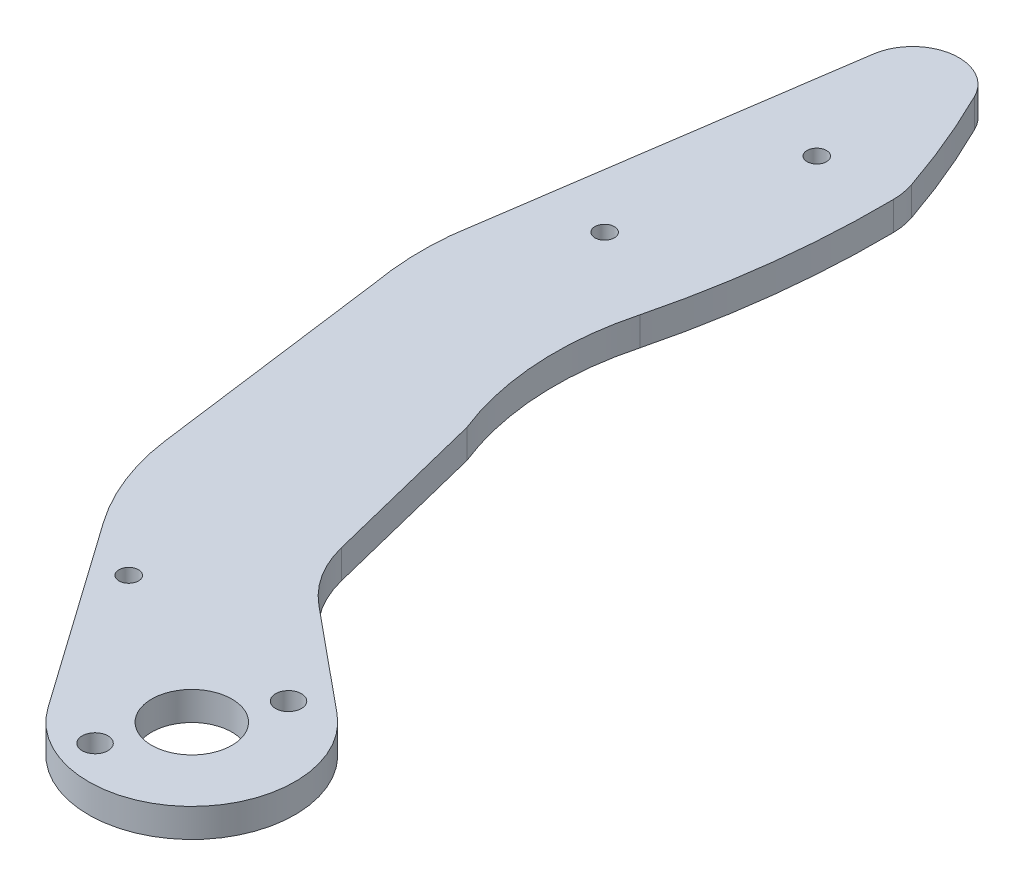
ISO-10303-21;
HEADER;
FILE_DESCRIPTION(('STEP AP214'),'2;1');
FILE_NAME('part.step','',(''),(''),'','','');
FILE_SCHEMA(('AUTOMOTIVE_DESIGN { 1 0 10303 214 1 1 1 1 }'));
ENDSEC;
DATA;
#1=APPLICATION_CONTEXT('core data for automotive mechanical design processes');
#2=APPLICATION_PROTOCOL_DEFINITION('international standard','automotive_design',2000,#1);
#3=PRODUCT_CONTEXT('',#1,'mechanical');
#4=PRODUCT('Part','Part','',(#3));
#5=PRODUCT_RELATED_PRODUCT_CATEGORY('part','',(#4));
#6=PRODUCT_DEFINITION_FORMATION('','',#4);
#7=PRODUCT_DEFINITION_CONTEXT('part definition',#1,'design');
#8=PRODUCT_DEFINITION('design','',#6,#7);
#9=PRODUCT_DEFINITION_SHAPE('','',#8);
#10=(LENGTH_UNIT() NAMED_UNIT(*) SI_UNIT(.MILLI.,.METRE.));
#11=(NAMED_UNIT(*) PLANE_ANGLE_UNIT() SI_UNIT($,.RADIAN.));
#12=(NAMED_UNIT(*) SI_UNIT($,.STERADIAN.) SOLID_ANGLE_UNIT());
#13=UNCERTAINTY_MEASURE_WITH_UNIT(LENGTH_MEASURE(1.E-05),#10,'distance_accuracy_value','');
#14=(GEOMETRIC_REPRESENTATION_CONTEXT(3) GLOBAL_UNCERTAINTY_ASSIGNED_CONTEXT((#13)) GLOBAL_UNIT_ASSIGNED_CONTEXT((#10,
#11,#12)) REPRESENTATION_CONTEXT('',''));
#15=CARTESIAN_POINT('',(0.,0.,0.));
#16=DIRECTION('',(0.,0.,1.));
#17=DIRECTION('',(1.,0.,0.));
#18=AXIS2_PLACEMENT_3D('',#15,#16,#17);
#19=CARTESIAN_POINT('',(0.,5.,0.));
#20=DIRECTION('',(0.,-1.,0.));
#21=DIRECTION('',(0.,0.,-1.));
#22=AXIS2_PLACEMENT_3D('',#19,#20,#21);
#23=PLANE('',#22);
#24=CARTESIAN_POINT('',(-5.25120650732144,5.,11.6184048051987));
#25=DIRECTION('',(0.,1.,0.));
#26=DIRECTION('',(0.,0.,1.));
#27=AXIS2_PLACEMENT_3D('',#24,#25,#26);
#28=CIRCLE('',#27,2.24999999999999);
#29=CARTESIAN_POINT('',(-5.25120650732144,5.,13.8684048051987));
#30=VERTEX_POINT('',#29);
#31=EDGE_CURVE('E326',#30,#30,#28,.T.);
#32=ORIENTED_EDGE('',*,*,#31,.F.);
#33=EDGE_LOOP('',(#32));
#34=FACE_BOUND('',#33,.T.);
#35=CARTESIAN_POINT('',(-31.,5.,-140.));
#36=DIRECTION('',(0.,1.,0.));
#37=DIRECTION('',(0.,0.,1.));
#38=AXIS2_PLACEMENT_3D('',#35,#36,#37);
#39=CIRCLE('',#38,1.7);
#40=CARTESIAN_POINT('',(-31.,5.,-138.3));
#41=VERTEX_POINT('',#40);
#42=EDGE_CURVE('E333',#41,#41,#39,.T.);
#43=ORIENTED_EDGE('',*,*,#42,.F.);
#44=EDGE_LOOP('',(#43));
#45=FACE_BOUND('',#44,.T.);
#46=CARTESIAN_POINT('',(-38.,5.,-110.));
#47=DIRECTION('',(0.,1.,0.));
#48=DIRECTION('',(0.,0.,1.));
#49=AXIS2_PLACEMENT_3D('',#46,#47,#48);
#50=CIRCLE('',#49,1.7);
#51=CARTESIAN_POINT('',(-38.,5.,-108.3));
#52=VERTEX_POINT('',#51);
#53=EDGE_CURVE('E340',#52,#52,#50,.T.);
#54=ORIENTED_EDGE('',*,*,#53,.F.);
#55=EDGE_LOOP('',(#54));
#56=FACE_BOUND('',#55,.T.);
#57=CARTESIAN_POINT('',(0.,5.,0.));
#58=DIRECTION('',(0.,1.,0.));
#59=DIRECTION('',(0.,0.,-1.));
#60=AXIS2_PLACEMENT_3D('',#57,#58,#59);
#61=CIRCLE('',#60,18.);
#62=CARTESIAN_POINT('',(-14.7090417206775,5.,10.3751670665763));
#63=VERTEX_POINT('',#62);
#64=CARTESIAN_POINT('',(11.4464775057828,5.,-13.8916576660098));
#65=VERTEX_POINT('',#64);
#66=EDGE_CURVE('E199',#63,#65,#61,.T.);
#67=ORIENTED_EDGE('',*,*,#66,.T.);
#68=DIRECTION('',(-0.771758759222768,0.,-0.635915416987931));
#69=VECTOR('',#68,1.);
#70=CARTESIAN_POINT('',(11.4464775057828,5.,-13.8916576660098));
#71=LINE('',#70,#69);
#72=CARTESIAN_POINT('',(-6.60695362920451,5.,-28.7673620892809));
#73=VERTEX_POINT('',#72);
#74=EDGE_CURVE('E117',#65,#73,#71,.T.);
#75=ORIENTED_EDGE('',*,*,#74,.T.);
#76=CARTESIAN_POINT('',(6.11135471055411,5.,-44.2025372737363));
#77=DIRECTION('',(0.,-1.,0.));
#78=DIRECTION('',(0.,0.,-1.));
#79=AXIS2_PLACEMENT_3D('',#76,#77,#78);
#80=CIRCLE('',#79,20.);
#81=CARTESIAN_POINT('',(-13.2989437963698,5.,-39.381716609979));
#82=VERTEX_POINT('',#81);
#83=EDGE_CURVE('E233',#73,#82,#80,.T.);
#84=ORIENTED_EDGE('',*,*,#83,.T.);
#85=DIRECTION('',(-0.241041033187863,0.,-0.970514925346193));
#86=VECTOR('',#85,1.);
#87=CARTESIAN_POINT('',(-13.2989437963698,5.,-39.381716609979));
#88=LINE('',#87,#86);
#89=CARTESIAN_POINT('',(-20.5301747920056,5.,-68.4971643703648));
#90=VERTEX_POINT('',#89);
#91=EDGE_CURVE('E252',#82,#90,#88,.T.);
#92=ORIENTED_EDGE('',*,*,#91,.T.);
#93=CARTESIAN_POINT('',(26.9937980567859,5.,-87.4580042567529));
#94=DIRECTION('',(0.,-1.,0.));
#95=DIRECTION('',(0.,0.,1.));
#96=AXIS2_PLACEMENT_3D('',#93,#94,#95);
#97=CIRCLE('',#96,51.1668002178163);
#98=CARTESIAN_POINT('',(-22.4565511628832,5.,-100.599709115054));
#99=VERTEX_POINT('',#98);
#100=EDGE_CURVE('E249',#90,#99,#97,.T.);
#101=ORIENTED_EDGE('',*,*,#100,.T.);
#102=CARTESIAN_POINT('',(-171.2572125516,5.,-138.292363187831));
#103=DIRECTION('',(0.,1.,0.));
#104=DIRECTION('',(0.,0.,1.));
#105=AXIS2_PLACEMENT_3D('',#102,#103,#104);
#106=CIRCLE('',#105,153.500400653449);
#107=CARTESIAN_POINT('',(-17.7680269599981,5.,-140.147870449029));
#108=VERTEX_POINT('',#107);
#109=EDGE_CURVE('E251',#99,#108,#106,.T.);
#110=ORIENTED_EDGE('',*,*,#109,.T.);
#111=CARTESIAN_POINT('',(-30.,5.,-140.));
#112=DIRECTION('',(0.,1.,0.));
#113=DIRECTION('',(0.,0.,1.));
#114=AXIS2_PLACEMENT_3D('',#111,#112,#113);
#115=CIRCLE('',#114,12.2328667989573);
#116=CARTESIAN_POINT('',(-18.4178287610431,5.,-143.93653902718));
#117=VERTEX_POINT('',#116);
#118=EDGE_CURVE('E254',#108,#117,#115,.T.);
#119=ORIENTED_EDGE('',*,*,#118,.T.);
#120=CARTESIAN_POINT('',(-163.753174500954,5.,-94.5400788358876));
#121=DIRECTION('',(0.,1.,0.));
#122=DIRECTION('',(0.,0.,1.));
#123=AXIS2_PLACEMENT_3D('',#120,#121,#122);
#124=CIRCLE('',#123,153.500400653449);
#125=CARTESIAN_POINT('',(-26.2562949035577,5.,-162.782156044517));
#126=VERTEX_POINT('',#125);
#127=EDGE_CURVE('E260',#117,#126,#124,.T.);
#128=ORIENTED_EDGE('',*,*,#127,.T.);
#129=CARTESIAN_POINT('',(-33.4913170526785,5.,-159.191289535021));
#130=DIRECTION('',(0.,1.,0.));
#131=DIRECTION('',(0.,0.,1.));
#132=AXIS2_PLACEMENT_3D('',#129,#130,#131);
#133=CIRCLE('',#132,8.0771200181305);
#134=CARTESIAN_POINT('',(-41.4826176844214,5.,-160.365590178123));
#135=VERTEX_POINT('',#134);
#136=EDGE_CURVE('E262',#126,#135,#133,.T.);
#137=ORIENTED_EDGE('',*,*,#136,.T.);
#138=DIRECTION('',(-0.145386058454699,0.,0.989375001709163));
#139=VECTOR('',#138,1.);
#140=CARTESIAN_POINT('',(-41.4826176844214,5.,-160.365590178123));
#141=LINE('',#140,#139);
#142=CARTESIAN_POINT('',(-50.9327114839769,5.,-96.0562150670269));
#143=VERTEX_POINT('',#142);
#144=EDGE_CURVE('E264',#135,#143,#141,.T.);
#145=ORIENTED_EDGE('',*,*,#144,.T.);
#146=CARTESIAN_POINT('',(0.00716740026227708,5.,-91.2426733575386));
#147=DIRECTION('',(0.,1.,0.));
#148=DIRECTION('',(0.,0.,1.));
#149=AXIS2_PLACEMENT_3D('',#146,#147,#148);
#150=CIRCLE('',#149,51.1668002178164);
#151=CARTESIAN_POINT('',(-50.3834749970696,5.,-82.3643512573803));
#152=VERTEX_POINT('',#151);
#153=EDGE_CURVE('E154',#143,#152,#150,.T.);
#154=ORIENTED_EDGE('',*,*,#153,.T.);
#155=DIRECTION('',(0.130981717678106,0.,0.991384783842325));
#156=VECTOR('',#155,1.);
#157=CARTESIAN_POINT('',(-50.3834749970696,5.,-82.3643512573803));
#158=LINE('',#157,#156);
#159=CARTESIAN_POINT('',(-44.8192942270945,5.,-40.2497397857414));
#160=VERTEX_POINT('',#159);
#161=EDGE_CURVE('E148',#152,#160,#158,.T.);
#162=ORIENTED_EDGE('',*,*,#161,.T.);
#163=CARTESIAN_POINT('',(-5.16390287340153,5.,-45.4890084928656));
#164=DIRECTION('',(0.,1.,0.));
#165=DIRECTION('',(0.,0.,1.));
#166=AXIS2_PLACEMENT_3D('',#163,#164,#165);
#167=CIRCLE('',#166,40.);
#168=CARTESIAN_POINT('',(-37.8506622526848,5.,-22.4330816782516));
#169=VERTEX_POINT('',#168);
#170=EDGE_CURVE('E152',#160,#169,#167,.T.);
#171=ORIENTED_EDGE('',*,*,#170,.T.);
#172=DIRECTION('',(0.576398170365351,0.,0.817168984482081));
#173=VECTOR('',#172,1.);
#174=CARTESIAN_POINT('',(-37.8506622526848,5.,-22.4330816782516));
#175=LINE('',#174,#173);
#176=EDGE_CURVE('E56',#169,#63,#175,.T.);
#177=ORIENTED_EDGE('',*,*,#176,.T.);
#178=EDGE_LOOP('',(#67,#75,#84,#92,#101,#110,#119,#128,#137,#145,#154,#162,#171,#177));
#179=FACE_BOUND('',#178,.T.);
#180=CARTESIAN_POINT('',(0.,5.,0.));
#181=DIRECTION('',(0.,1.,0.));
#182=DIRECTION('',(0.,0.,1.));
#183=AXIS2_PLACEMENT_3D('',#180,#181,#182);
#184=CIRCLE('',#183,7.);
#185=CARTESIAN_POINT('',(0.,5.,7.));
#186=VERTEX_POINT('',#185);
#187=EDGE_CURVE('E176',#186,#186,#184,.T.);
#188=ORIENTED_EDGE('',*,*,#187,.F.);
#189=EDGE_LOOP('',(#188));
#190=FACE_BOUND('',#189,.T.);
#191=CARTESIAN_POINT('',(-27.6732846118374,5.,-16.6790083276029));
#192=DIRECTION('',(0.,1.,0.));
#193=DIRECTION('',(0.,0.,1.));
#194=AXIS2_PLACEMENT_3D('',#191,#192,#193);
#195=CIRCLE('',#194,1.7);
#196=CARTESIAN_POINT('',(-27.6732846118374,5.,-14.9790083276029));
#197=VERTEX_POINT('',#196);
#198=EDGE_CURVE('E346',#197,#197,#195,.T.);
#199=ORIENTED_EDGE('',*,*,#198,.F.);
#200=EDGE_LOOP('',(#199));
#201=FACE_BOUND('',#200,.T.);
#202=CARTESIAN_POINT('',(5.25120650732144,5.,-11.6184048051987));
#203=DIRECTION('',(0.,1.,0.));
#204=DIRECTION('',(0.,0.,1.));
#205=AXIS2_PLACEMENT_3D('',#202,#203,#204);
#206=CIRCLE('',#205,2.24999999999999);
#207=CARTESIAN_POINT('',(5.25120650732144,5.,-9.36840480519874));
#208=VERTEX_POINT('',#207);
#209=EDGE_CURVE('E328',#208,#208,#206,.T.);
#210=ORIENTED_EDGE('',*,*,#209,.F.);
#211=EDGE_LOOP('',(#210));
#212=FACE_BOUND('',#211,.T.);
#213=ADVANCED_FACE('F38',(#34,#45,#56,#179,#190,#201,#212),#23,.F.);
#214=CARTESIAN_POINT('',(0.,0.,0.));
#215=DIRECTION('',(0.,-1.,0.));
#216=DIRECTION('',(0.,0.,-1.));
#217=AXIS2_PLACEMENT_3D('',#214,#215,#216);
#218=PLANE('',#217);
#219=CARTESIAN_POINT('',(-5.25120650732144,0.,11.6184048051987));
#220=DIRECTION('',(0.,-1.,0.));
#221=DIRECTION('',(0.,0.,-1.));
#222=AXIS2_PLACEMENT_3D('',#219,#220,#221);
#223=CIRCLE('',#222,2.24999999999999);
#224=CARTESIAN_POINT('',(-5.25120650732144,0.,9.36840480519874));
#225=VERTEX_POINT('',#224);
#226=EDGE_CURVE('E324',#225,#225,#223,.T.);
#227=ORIENTED_EDGE('',*,*,#226,.F.);
#228=EDGE_LOOP('',(#227));
#229=FACE_BOUND('',#228,.T.);
#230=CARTESIAN_POINT('',(5.25120650732144,0.,-11.6184048051987));
#231=DIRECTION('',(0.,-1.,0.));
#232=DIRECTION('',(0.,0.,-1.));
#233=AXIS2_PLACEMENT_3D('',#230,#231,#232);
#234=CIRCLE('',#233,2.24999999999999);
#235=CARTESIAN_POINT('',(5.25120650732144,0.,-13.8684048051987));
#236=VERTEX_POINT('',#235);
#237=EDGE_CURVE('E42',#236,#236,#234,.T.);
#238=ORIENTED_EDGE('',*,*,#237,.F.);
#239=EDGE_LOOP('',(#238));
#240=FACE_BOUND('',#239,.T.);
#241=CARTESIAN_POINT('',(-31.,0.,-140.));
#242=DIRECTION('',(0.,-1.,0.));
#243=DIRECTION('',(0.,0.,-1.));
#244=AXIS2_PLACEMENT_3D('',#241,#242,#243);
#245=CIRCLE('',#244,1.7);
#246=CARTESIAN_POINT('',(-31.,0.,-141.7));
#247=VERTEX_POINT('',#246);
#248=EDGE_CURVE('E337',#247,#247,#245,.F.);
#249=ORIENTED_EDGE('',*,*,#248,.T.);
#250=EDGE_LOOP('',(#249));
#251=FACE_BOUND('',#250,.T.);
#252=CARTESIAN_POINT('',(-38.,0.,-110.));
#253=DIRECTION('',(0.,-1.,0.));
#254=DIRECTION('',(0.,0.,-1.));
#255=AXIS2_PLACEMENT_3D('',#252,#253,#254);
#256=CIRCLE('',#255,1.7);
#257=CARTESIAN_POINT('',(-38.,0.,-111.7));
#258=VERTEX_POINT('',#257);
#259=EDGE_CURVE('E343',#258,#258,#256,.F.);
#260=ORIENTED_EDGE('',*,*,#259,.T.);
#261=EDGE_LOOP('',(#260));
#262=FACE_BOUND('',#261,.T.);
#263=CARTESIAN_POINT('',(0.,0.,0.));
#264=DIRECTION('',(0.,1.,0.));
#265=DIRECTION('',(0.,0.,1.));
#266=AXIS2_PLACEMENT_3D('',#263,#264,#265);
#267=CIRCLE('',#266,7.);
#268=CARTESIAN_POINT('',(0.,0.,7.));
#269=VERTEX_POINT('',#268);
#270=EDGE_CURVE('E349',#269,#269,#267,.T.);
#271=ORIENTED_EDGE('',*,*,#270,.T.);
#272=EDGE_LOOP('',(#271));
#273=FACE_BOUND('',#272,.T.);
#274=CARTESIAN_POINT('',(0.,0.,0.));
#275=DIRECTION('',(0.,1.,0.));
#276=DIRECTION('',(0.,0.,-1.));
#277=AXIS2_PLACEMENT_3D('',#274,#275,#276);
#278=CIRCLE('',#277,18.);
#279=CARTESIAN_POINT('',(-14.7090417206775,0.,10.3751670665763));
#280=VERTEX_POINT('',#279);
#281=CARTESIAN_POINT('',(11.4464775057828,0.,-13.8916576660098));
#282=VERTEX_POINT('',#281);
#283=EDGE_CURVE('E172',#280,#282,#278,.T.);
#284=ORIENTED_EDGE('',*,*,#283,.F.);
#285=DIRECTION('',(0.576398170365351,0.,0.817168984482081));
#286=VECTOR('',#285,1.);
#287=CARTESIAN_POINT('',(-37.8506622526848,0.,-22.4330816782516));
#288=LINE('',#287,#286);
#289=CARTESIAN_POINT('',(-37.8506622526848,0.,-22.4330816782516));
#290=VERTEX_POINT('',#289);
#291=EDGE_CURVE('E109',#290,#280,#288,.T.);
#292=ORIENTED_EDGE('',*,*,#291,.F.);
#293=CARTESIAN_POINT('',(-5.16390287340153,0.,-45.4890084928656));
#294=DIRECTION('',(0.,1.,0.));
#295=DIRECTION('',(0.,0.,1.));
#296=AXIS2_PLACEMENT_3D('',#293,#294,#295);
#297=CIRCLE('',#296,40.);
#298=CARTESIAN_POINT('',(-44.8192942270945,0.,-40.2497397857414));
#299=VERTEX_POINT('',#298);
#300=EDGE_CURVE('E103',#299,#290,#297,.T.);
#301=ORIENTED_EDGE('',*,*,#300,.F.);
#302=DIRECTION('',(0.130981717678106,0.,0.991384783842325));
#303=VECTOR('',#302,1.);
#304=CARTESIAN_POINT('',(-50.3834749970696,0.,-82.3643512573803));
#305=LINE('',#304,#303);
#306=CARTESIAN_POINT('',(-50.3834749970696,0.,-82.3643512573803));
#307=VERTEX_POINT('',#306);
#308=EDGE_CURVE('E162',#307,#299,#305,.T.);
#309=ORIENTED_EDGE('',*,*,#308,.F.);
#310=CARTESIAN_POINT('',(0.00716740026227708,0.,-91.2426733575386));
#311=DIRECTION('',(0.,1.,0.));
#312=DIRECTION('',(0.,0.,1.));
#313=AXIS2_PLACEMENT_3D('',#310,#311,#312);
#314=CIRCLE('',#313,51.1668002178164);
#315=CARTESIAN_POINT('',(-50.9327114839769,0.,-96.0562150670269));
#316=VERTEX_POINT('',#315);
#317=EDGE_CURVE('E194',#316,#307,#314,.T.);
#318=ORIENTED_EDGE('',*,*,#317,.F.);
#319=DIRECTION('',(-0.145386058454699,0.,0.989375001709163));
#320=VECTOR('',#319,1.);
#321=CARTESIAN_POINT('',(-41.4826176844214,0.,-160.365590178123));
#322=LINE('',#321,#320);
#323=CARTESIAN_POINT('',(-41.4826176844214,0.,-160.365590178123));
#324=VERTEX_POINT('',#323);
#325=EDGE_CURVE('E192',#324,#316,#322,.T.);
#326=ORIENTED_EDGE('',*,*,#325,.F.);
#327=CARTESIAN_POINT('',(-33.4913170526785,0.,-159.191289535021));
#328=DIRECTION('',(0.,1.,0.));
#329=DIRECTION('',(0.,0.,1.));
#330=AXIS2_PLACEMENT_3D('',#327,#328,#329);
#331=CIRCLE('',#330,8.0771200181305);
#332=CARTESIAN_POINT('',(-26.2562949035577,0.,-162.782156044517));
#333=VERTEX_POINT('',#332);
#334=EDGE_CURVE('E190',#333,#324,#331,.T.);
#335=ORIENTED_EDGE('',*,*,#334,.F.);
#336=CARTESIAN_POINT('',(-163.753174500954,0.,-94.5400788358876));
#337=DIRECTION('',(0.,1.,0.));
#338=DIRECTION('',(0.,0.,1.));
#339=AXIS2_PLACEMENT_3D('',#336,#337,#338);
#340=CIRCLE('',#339,153.500400653449);
#341=CARTESIAN_POINT('',(-18.4178287610431,0.,-143.93653902718));
#342=VERTEX_POINT('',#341);
#343=EDGE_CURVE('E188',#342,#333,#340,.T.);
#344=ORIENTED_EDGE('',*,*,#343,.F.);
#345=CARTESIAN_POINT('',(-30.,0.,-140.));
#346=DIRECTION('',(0.,1.,0.));
#347=DIRECTION('',(0.,0.,1.));
#348=AXIS2_PLACEMENT_3D('',#345,#346,#347);
#349=CIRCLE('',#348,12.2328667989573);
#350=CARTESIAN_POINT('',(-17.7680269599981,0.,-140.147870449029));
#351=VERTEX_POINT('',#350);
#352=EDGE_CURVE('E186',#351,#342,#349,.T.);
#353=ORIENTED_EDGE('',*,*,#352,.F.);
#354=CARTESIAN_POINT('',(-171.2572125516,0.,-138.292363187831));
#355=DIRECTION('',(0.,1.,0.));
#356=DIRECTION('',(0.,0.,1.));
#357=AXIS2_PLACEMENT_3D('',#354,#355,#356);
#358=CIRCLE('',#357,153.500400653449);
#359=CARTESIAN_POINT('',(-22.4565511628832,0.,-100.599709115054));
#360=VERTEX_POINT('',#359);
#361=EDGE_CURVE('E184',#360,#351,#358,.T.);
#362=ORIENTED_EDGE('',*,*,#361,.F.);
#363=CARTESIAN_POINT('',(26.9937980567859,0.,-87.4580042567529));
#364=DIRECTION('',(0.,-1.,0.));
#365=DIRECTION('',(0.,0.,1.));
#366=AXIS2_PLACEMENT_3D('',#363,#364,#365);
#367=CIRCLE('',#366,51.1668002178163);
#368=CARTESIAN_POINT('',(-20.5301747920056,0.,-68.4971643703648));
#369=VERTEX_POINT('',#368);
#370=EDGE_CURVE('E182',#369,#360,#367,.T.);
#371=ORIENTED_EDGE('',*,*,#370,.F.);
#372=DIRECTION('',(-0.241041033187863,0.,-0.970514925346193));
#373=VECTOR('',#372,1.);
#374=CARTESIAN_POINT('',(-13.2989437963698,0.,-39.381716609979));
#375=LINE('',#374,#373);
#376=CARTESIAN_POINT('',(-13.2989437963698,0.,-39.381716609979));
#377=VERTEX_POINT('',#376);
#378=EDGE_CURVE('E180',#377,#369,#375,.T.);
#379=ORIENTED_EDGE('',*,*,#378,.F.);
#380=CARTESIAN_POINT('',(6.11135471055411,0.,-44.2025372737363));
#381=DIRECTION('',(0.,-1.,0.));
#382=DIRECTION('',(0.,0.,-1.));
#383=AXIS2_PLACEMENT_3D('',#380,#381,#382);
#384=CIRCLE('',#383,20.);
#385=CARTESIAN_POINT('',(-6.60695362920451,0.,-28.7673620892809));
#386=VERTEX_POINT('',#385);
#387=EDGE_CURVE('E178',#386,#377,#384,.T.);
#388=ORIENTED_EDGE('',*,*,#387,.F.);
#389=DIRECTION('',(-0.771758759222768,0.,-0.635915416987931));
#390=VECTOR('',#389,1.);
#391=CARTESIAN_POINT('',(11.4464775057828,0.,-13.8916576660098));
#392=LINE('',#391,#390);
#393=EDGE_CURVE('E175',#282,#386,#392,.T.);
#394=ORIENTED_EDGE('',*,*,#393,.F.);
#395=EDGE_LOOP('',(#284,#292,#301,#309,#318,#326,#335,#344,#353,#362,#371,#379,#388,#394));
#396=FACE_BOUND('',#395,.T.);
#397=CARTESIAN_POINT('',(-27.6732846118374,0.,-16.6790083276029));
#398=DIRECTION('',(0.,1.,0.));
#399=DIRECTION('',(0.,0.,1.));
#400=AXIS2_PLACEMENT_3D('',#397,#398,#399);
#401=CIRCLE('',#400,1.7);
#402=CARTESIAN_POINT('',(-27.6732846118374,0.,-14.9790083276029));
#403=VERTEX_POINT('',#402);
#404=EDGE_CURVE('E336',#403,#403,#401,.T.);
#405=ORIENTED_EDGE('',*,*,#404,.T.);
#406=EDGE_LOOP('',(#405));
#407=FACE_BOUND('',#406,.T.);
#408=ADVANCED_FACE('F237',(#229,#240,#251,#262,#273,#396,#407),#218,.T.);
#409=CARTESIAN_POINT('',(0.,5.,0.));
#410=DIRECTION('',(0.,-1.,0.));
#411=DIRECTION('',(0.,0.,-1.));
#412=AXIS2_PLACEMENT_3D('',#409,#410,#411);
#413=CYLINDRICAL_SURFACE('',#412,18.);
#414=ORIENTED_EDGE('',*,*,#283,.T.);
#415=DIRECTION('',(0.,-1.,0.));
#416=VECTOR('',#415,1.);
#417=CARTESIAN_POINT('',(11.4464775057828,5.,-13.8916576660098));
#418=LINE('',#417,#416);
#419=EDGE_CURVE('E11',#65,#282,#418,.T.);
#420=ORIENTED_EDGE('',*,*,#419,.F.);
#421=ORIENTED_EDGE('',*,*,#66,.F.);
#422=DIRECTION('',(0.,-1.,0.));
#423=VECTOR('',#422,1.);
#424=CARTESIAN_POINT('',(-14.7090417206775,5.,10.3751670665763));
#425=LINE('',#424,#423);
#426=EDGE_CURVE('E168',#63,#280,#425,.T.);
#427=ORIENTED_EDGE('',*,*,#426,.T.);
#428=EDGE_LOOP('',(#414,#420,#421,#427));
#429=FACE_BOUND('',#428,.T.);
#430=ADVANCED_FACE('F40',(#429),#413,.T.);
#431=CARTESIAN_POINT('',(11.4464775057828,5.,-13.8916576660098));
#432=DIRECTION('',(-0.635915416987931,0.,0.771758759222768));
#433=DIRECTION('',(0.771758759222768,0.,0.635915416987931));
#434=AXIS2_PLACEMENT_3D('',#431,#432,#433);
#435=PLANE('',#434);
#436=ORIENTED_EDGE('',*,*,#393,.T.);
#437=DIRECTION('',(0.,-1.,0.));
#438=VECTOR('',#437,1.);
#439=CARTESIAN_POINT('',(-6.60695362920451,5.,-28.7673620892809));
#440=LINE('',#439,#438);
#441=EDGE_CURVE('E48',#73,#386,#440,.T.);
#442=ORIENTED_EDGE('',*,*,#441,.F.);
#443=ORIENTED_EDGE('',*,*,#74,.F.);
#444=ORIENTED_EDGE('',*,*,#419,.T.);
#445=EDGE_LOOP('',(#436,#442,#443,#444));
#446=FACE_BOUND('',#445,.T.);
#447=ADVANCED_FACE('F501',(#446),#435,.F.);
#448=CARTESIAN_POINT('',(6.11135471055411,5.,-44.2025372737363));
#449=DIRECTION('',(0.,-1.,0.));
#450=DIRECTION('',(0.,0.,-1.));
#451=AXIS2_PLACEMENT_3D('',#448,#449,#450);
#452=CYLINDRICAL_SURFACE('',#451,20.);
#453=ORIENTED_EDGE('',*,*,#387,.T.);
#454=DIRECTION('',(0.,-1.,0.));
#455=VECTOR('',#454,1.);
#456=CARTESIAN_POINT('',(-13.2989437963698,5.,-39.381716609979));
#457=LINE('',#456,#455);
#458=EDGE_CURVE('E224',#82,#377,#457,.T.);
#459=ORIENTED_EDGE('',*,*,#458,.F.);
#460=ORIENTED_EDGE('',*,*,#83,.F.);
#461=ORIENTED_EDGE('',*,*,#441,.T.);
#462=EDGE_LOOP('',(#453,#459,#460,#461));
#463=FACE_BOUND('',#462,.T.);
#464=ADVANCED_FACE('F231',(#463),#452,.F.);
#465=CARTESIAN_POINT('',(-13.2989437963698,5.,-39.381716609979));
#466=DIRECTION('',(-0.970514925346193,0.,0.241041033187863));
#467=DIRECTION('',(0.241041033187863,0.,0.970514925346194));
#468=AXIS2_PLACEMENT_3D('',#465,#466,#467);
#469=PLANE('',#468);
#470=ORIENTED_EDGE('',*,*,#378,.T.);
#471=DIRECTION('',(0.,-1.,0.));
#472=VECTOR('',#471,1.);
#473=CARTESIAN_POINT('',(-20.5301747920056,5.,-68.4971643703648));
#474=LINE('',#473,#472);
#475=EDGE_CURVE('E221',#90,#369,#474,.T.);
#476=ORIENTED_EDGE('',*,*,#475,.F.);
#477=ORIENTED_EDGE('',*,*,#91,.F.);
#478=ORIENTED_EDGE('',*,*,#458,.T.);
#479=EDGE_LOOP('',(#470,#476,#477,#478));
#480=FACE_BOUND('',#479,.T.);
#481=ADVANCED_FACE('F243',(#480),#469,.F.);
#482=CARTESIAN_POINT('',(26.9937980567859,5.,-87.4580042567529));
#483=DIRECTION('',(0.,-1.,0.));
#484=DIRECTION('',(0.,0.,-1.));
#485=AXIS2_PLACEMENT_3D('',#482,#483,#484);
#486=CYLINDRICAL_SURFACE('',#485,51.1668002178163);
#487=ORIENTED_EDGE('',*,*,#370,.T.);
#488=DIRECTION('',(0.,-1.,0.));
#489=VECTOR('',#488,1.);
#490=CARTESIAN_POINT('',(-22.4565511628832,5.,-100.599709115054));
#491=LINE('',#490,#489);
#492=EDGE_CURVE('E218',#99,#360,#491,.T.);
#493=ORIENTED_EDGE('',*,*,#492,.F.);
#494=ORIENTED_EDGE('',*,*,#100,.F.);
#495=ORIENTED_EDGE('',*,*,#475,.T.);
#496=EDGE_LOOP('',(#487,#493,#494,#495));
#497=FACE_BOUND('',#496,.T.);
#498=ADVANCED_FACE('F247',(#497),#486,.F.);
#499=CARTESIAN_POINT('',(-171.2572125516,5.,-138.292363187831));
#500=DIRECTION('',(0.,-1.,0.));
#501=DIRECTION('',(0.,0.,-1.));
#502=AXIS2_PLACEMENT_3D('',#499,#500,#501);
#503=CYLINDRICAL_SURFACE('',#502,153.500400653449);
#504=ORIENTED_EDGE('',*,*,#361,.T.);
#505=DIRECTION('',(0.,-1.,0.));
#506=VECTOR('',#505,1.);
#507=CARTESIAN_POINT('',(-17.7680269599981,5.,-140.147870449029));
#508=LINE('',#507,#506);
#509=EDGE_CURVE('E215',#108,#351,#508,.T.);
#510=ORIENTED_EDGE('',*,*,#509,.F.);
#511=ORIENTED_EDGE('',*,*,#109,.F.);
#512=ORIENTED_EDGE('',*,*,#492,.T.);
#513=EDGE_LOOP('',(#504,#510,#511,#512));
#514=FACE_BOUND('',#513,.T.);
#515=ADVANCED_FACE('F466',(#514),#503,.T.);
#516=CARTESIAN_POINT('',(-30.,5.,-140.));
#517=DIRECTION('',(0.,-1.,0.));
#518=DIRECTION('',(0.,0.,-1.));
#519=AXIS2_PLACEMENT_3D('',#516,#517,#518);
#520=CYLINDRICAL_SURFACE('',#519,12.2328667989573);
#521=ORIENTED_EDGE('',*,*,#352,.T.);
#522=DIRECTION('',(0.,-1.,0.));
#523=VECTOR('',#522,1.);
#524=CARTESIAN_POINT('',(-18.4178287610431,5.,-143.93653902718));
#525=LINE('',#524,#523);
#526=EDGE_CURVE('E212',#117,#342,#525,.T.);
#527=ORIENTED_EDGE('',*,*,#526,.F.);
#528=ORIENTED_EDGE('',*,*,#118,.F.);
#529=ORIENTED_EDGE('',*,*,#509,.T.);
#530=EDGE_LOOP('',(#521,#527,#528,#529));
#531=FACE_BOUND('',#530,.T.);
#532=ADVANCED_FACE('F456',(#531),#520,.T.);
#533=CARTESIAN_POINT('',(-163.753174500954,5.,-94.5400788358876));
#534=DIRECTION('',(0.,-1.,0.));
#535=DIRECTION('',(0.,0.,-1.));
#536=AXIS2_PLACEMENT_3D('',#533,#534,#535);
#537=CYLINDRICAL_SURFACE('',#536,153.500400653449);
#538=ORIENTED_EDGE('',*,*,#343,.T.);
#539=DIRECTION('',(0.,-1.,0.));
#540=VECTOR('',#539,1.);
#541=CARTESIAN_POINT('',(-26.2562949035577,5.,-162.782156044517));
#542=LINE('',#541,#540);
#543=EDGE_CURVE('E209',#126,#333,#542,.T.);
#544=ORIENTED_EDGE('',*,*,#543,.F.);
#545=ORIENTED_EDGE('',*,*,#127,.F.);
#546=ORIENTED_EDGE('',*,*,#526,.T.);
#547=EDGE_LOOP('',(#538,#544,#545,#546));
#548=FACE_BOUND('',#547,.T.);
#549=ADVANCED_FACE('F446',(#548),#537,.T.);
#550=CARTESIAN_POINT('',(-33.4913170526785,5.,-159.191289535021));
#551=DIRECTION('',(0.,-1.,0.));
#552=DIRECTION('',(0.,0.,-1.));
#553=AXIS2_PLACEMENT_3D('',#550,#551,#552);
#554=CYLINDRICAL_SURFACE('',#553,8.0771200181305);
#555=ORIENTED_EDGE('',*,*,#334,.T.);
#556=DIRECTION('',(0.,-1.,0.));
#557=VECTOR('',#556,1.);
#558=CARTESIAN_POINT('',(-41.4826176844214,5.,-160.365590178123));
#559=LINE('',#558,#557);
#560=EDGE_CURVE('E206',#135,#324,#559,.T.);
#561=ORIENTED_EDGE('',*,*,#560,.F.);
#562=ORIENTED_EDGE('',*,*,#136,.F.);
#563=ORIENTED_EDGE('',*,*,#543,.T.);
#564=EDGE_LOOP('',(#555,#561,#562,#563));
#565=FACE_BOUND('',#564,.T.);
#566=ADVANCED_FACE('F437',(#565),#554,.T.);
#567=CARTESIAN_POINT('',(-41.4826176844214,5.,-160.365590178123));
#568=DIRECTION('',(0.989375001709163,0.,0.145386058454699));
#569=DIRECTION('',(0.145386058454699,0.,-0.989375001709163));
#570=AXIS2_PLACEMENT_3D('',#567,#568,#569);
#571=PLANE('',#570);
#572=ORIENTED_EDGE('',*,*,#325,.T.);
#573=DIRECTION('',(0.,-1.,0.));
#574=VECTOR('',#573,1.);
#575=CARTESIAN_POINT('',(-50.9327114839769,5.,-96.0562150670269));
#576=LINE('',#575,#574);
#577=EDGE_CURVE('E203',#143,#316,#576,.T.);
#578=ORIENTED_EDGE('',*,*,#577,.F.);
#579=ORIENTED_EDGE('',*,*,#144,.F.);
#580=ORIENTED_EDGE('',*,*,#560,.T.);
#581=EDGE_LOOP('',(#572,#578,#579,#580));
#582=FACE_BOUND('',#581,.T.);
#583=ADVANCED_FACE('F270',(#582),#571,.F.);
#584=CARTESIAN_POINT('',(0.00716740026227708,5.,-91.2426733575386));
#585=DIRECTION('',(0.,-1.,0.));
#586=DIRECTION('',(0.,0.,-1.));
#587=AXIS2_PLACEMENT_3D('',#584,#585,#586);
#588=CYLINDRICAL_SURFACE('',#587,51.1668002178164);
#589=ORIENTED_EDGE('',*,*,#317,.T.);
#590=DIRECTION('',(0.,-1.,0.));
#591=VECTOR('',#590,1.);
#592=CARTESIAN_POINT('',(-50.3834749970696,5.,-82.3643512573803));
#593=LINE('',#592,#591);
#594=EDGE_CURVE('E163',#152,#307,#593,.T.);
#595=ORIENTED_EDGE('',*,*,#594,.F.);
#596=ORIENTED_EDGE('',*,*,#153,.F.);
#597=ORIENTED_EDGE('',*,*,#577,.T.);
#598=EDGE_LOOP('',(#589,#595,#596,#597));
#599=FACE_BOUND('',#598,.T.);
#600=ADVANCED_FACE('F274',(#599),#588,.T.);
#601=CARTESIAN_POINT('',(-50.3834749970696,5.,-82.3643512573803));
#602=DIRECTION('',(0.991384783842325,0.,-0.130981717678106));
#603=DIRECTION('',(-0.130981717678106,0.,-0.991384783842325));
#604=AXIS2_PLACEMENT_3D('',#601,#602,#603);
#605=PLANE('',#604);
#606=ORIENTED_EDGE('',*,*,#308,.T.);
#607=DIRECTION('',(0.,-1.,0.));
#608=VECTOR('',#607,1.);
#609=CARTESIAN_POINT('',(-44.8192942270945,5.,-40.2497397857414));
#610=LINE('',#609,#608);
#611=EDGE_CURVE('E159',#160,#299,#610,.T.);
#612=ORIENTED_EDGE('',*,*,#611,.F.);
#613=ORIENTED_EDGE('',*,*,#161,.F.);
#614=ORIENTED_EDGE('',*,*,#594,.T.);
#615=EDGE_LOOP('',(#606,#612,#613,#614));
#616=FACE_BOUND('',#615,.T.);
#617=ADVANCED_FACE('F160',(#616),#605,.F.);
#618=CARTESIAN_POINT('',(-5.16390287340153,5.,-45.4890084928656));
#619=DIRECTION('',(0.,-1.,0.));
#620=DIRECTION('',(0.,0.,-1.));
#621=AXIS2_PLACEMENT_3D('',#618,#619,#620);
#622=CYLINDRICAL_SURFACE('',#621,40.);
#623=ORIENTED_EDGE('',*,*,#300,.T.);
#624=DIRECTION('',(0.,-1.,0.));
#625=VECTOR('',#624,1.);
#626=CARTESIAN_POINT('',(-37.8506622526848,5.,-22.4330816782516));
#627=LINE('',#626,#625);
#628=EDGE_CURVE('E164',#169,#290,#627,.T.);
#629=ORIENTED_EDGE('',*,*,#628,.F.);
#630=ORIENTED_EDGE('',*,*,#170,.F.);
#631=ORIENTED_EDGE('',*,*,#611,.T.);
#632=EDGE_LOOP('',(#623,#629,#630,#631));
#633=FACE_BOUND('',#632,.T.);
#634=ADVANCED_FACE('F166',(#633),#622,.T.);
#635=CARTESIAN_POINT('',(-37.8506622526848,5.,-22.4330816782516));
#636=DIRECTION('',(0.817168984482081,0.,-0.576398170365351));
#637=DIRECTION('',(-0.576398170365351,0.,-0.817168984482081));
#638=AXIS2_PLACEMENT_3D('',#635,#636,#637);
#639=PLANE('',#638);
#640=ORIENTED_EDGE('',*,*,#291,.T.);
#641=ORIENTED_EDGE('',*,*,#426,.F.);
#642=ORIENTED_EDGE('',*,*,#176,.F.);
#643=ORIENTED_EDGE('',*,*,#628,.T.);
#644=EDGE_LOOP('',(#640,#641,#642,#643));
#645=FACE_BOUND('',#644,.T.);
#646=ADVANCED_FACE('F278',(#645),#639,.F.);
#647=CARTESIAN_POINT('',(0.,5.,0.));
#648=DIRECTION('',(0.,-1.,0.));
#649=DIRECTION('',(0.,0.,-1.));
#650=AXIS2_PLACEMENT_3D('',#647,#648,#649);
#651=CYLINDRICAL_SURFACE('',#650,7.);
#652=ORIENTED_EDGE('',*,*,#187,.T.);
#653=EDGE_LOOP('',(#652));
#654=FACE_BOUND('',#653,.T.);
#655=ORIENTED_EDGE('',*,*,#270,.F.);
#656=EDGE_LOOP('',(#655));
#657=FACE_BOUND('',#656,.T.);
#658=ADVANCED_FACE('F280',(#654,#657),#651,.F.);
#659=CARTESIAN_POINT('',(-27.6732846118374,5.,-16.6790083276029));
#660=DIRECTION('',(0.,-1.,0.));
#661=DIRECTION('',(0.,0.,-1.));
#662=AXIS2_PLACEMENT_3D('',#659,#660,#661);
#663=CYLINDRICAL_SURFACE('',#662,1.7);
#664=ORIENTED_EDGE('',*,*,#198,.T.);
#665=EDGE_LOOP('',(#664));
#666=FACE_BOUND('',#665,.T.);
#667=ORIENTED_EDGE('',*,*,#404,.F.);
#668=EDGE_LOOP('',(#667));
#669=FACE_BOUND('',#668,.T.);
#670=ADVANCED_FACE('F286',(#666,#669),#663,.F.);
#671=CARTESIAN_POINT('',(-38.,-0.00100000000000013,-110.));
#672=DIRECTION('',(0.,1.,0.));
#673=DIRECTION('',(0.,0.,1.));
#674=AXIS2_PLACEMENT_3D('',#671,#672,#673);
#675=CYLINDRICAL_SURFACE('',#674,1.7);
#676=ORIENTED_EDGE('',*,*,#259,.F.);
#677=EDGE_LOOP('',(#676));
#678=FACE_BOUND('',#677,.T.);
#679=ORIENTED_EDGE('',*,*,#53,.T.);
#680=EDGE_LOOP('',(#679));
#681=FACE_BOUND('',#680,.T.);
#682=ADVANCED_FACE('F303',(#678,#681),#675,.F.);
#683=CARTESIAN_POINT('',(-31.,-0.00100000000000013,-140.));
#684=DIRECTION('',(0.,1.,0.));
#685=DIRECTION('',(0.,0.,1.));
#686=AXIS2_PLACEMENT_3D('',#683,#684,#685);
#687=CYLINDRICAL_SURFACE('',#686,1.7);
#688=ORIENTED_EDGE('',*,*,#248,.F.);
#689=EDGE_LOOP('',(#688));
#690=FACE_BOUND('',#689,.T.);
#691=ORIENTED_EDGE('',*,*,#42,.T.);
#692=EDGE_LOOP('',(#691));
#693=FACE_BOUND('',#692,.T.);
#694=ADVANCED_FACE('F307',(#690,#693),#687,.F.);
#695=CARTESIAN_POINT('',(5.25120650732144,5.,-11.6184048051987));
#696=DIRECTION('',(0.,1.,0.));
#697=DIRECTION('',(0.,0.,1.));
#698=AXIS2_PLACEMENT_3D('',#695,#696,#697);
#699=CYLINDRICAL_SURFACE('',#698,2.24999999999999);
#700=ORIENTED_EDGE('',*,*,#237,.T.);
#701=EDGE_LOOP('',(#700));
#702=FACE_BOUND('',#701,.T.);
#703=ORIENTED_EDGE('',*,*,#209,.T.);
#704=EDGE_LOOP('',(#703));
#705=FACE_BOUND('',#704,.T.);
#706=ADVANCED_FACE('F311',(#702,#705),#699,.F.);
#707=CARTESIAN_POINT('',(-5.25120650732144,5.,11.6184048051987));
#708=DIRECTION('',(0.,1.,0.));
#709=DIRECTION('',(0.,0.,1.));
#710=AXIS2_PLACEMENT_3D('',#707,#708,#709);
#711=CYLINDRICAL_SURFACE('',#710,2.24999999999999);
#712=ORIENTED_EDGE('',*,*,#226,.T.);
#713=EDGE_LOOP('',(#712));
#714=FACE_BOUND('',#713,.T.);
#715=ORIENTED_EDGE('',*,*,#31,.T.);
#716=EDGE_LOOP('',(#715));
#717=FACE_BOUND('',#716,.T.);
#718=ADVANCED_FACE('F315',(#714,#717),#711,.F.);
#719=CLOSED_SHELL('',(#213,#408,#430,#447,#464,#481,#498,#515,#532,#549,#566,#583,#600,#617,
#634,#646,#658,#670,#682,#694,#706,#718));
#720=MANIFOLD_SOLID_BREP('B2',#719);
#721=ADVANCED_BREP_SHAPE_REPRESENTATION('',(#18,#720),#14);
#722=SHAPE_DEFINITION_REPRESENTATION(#9,#721);
ENDSEC;
END-ISO-10303-21;
